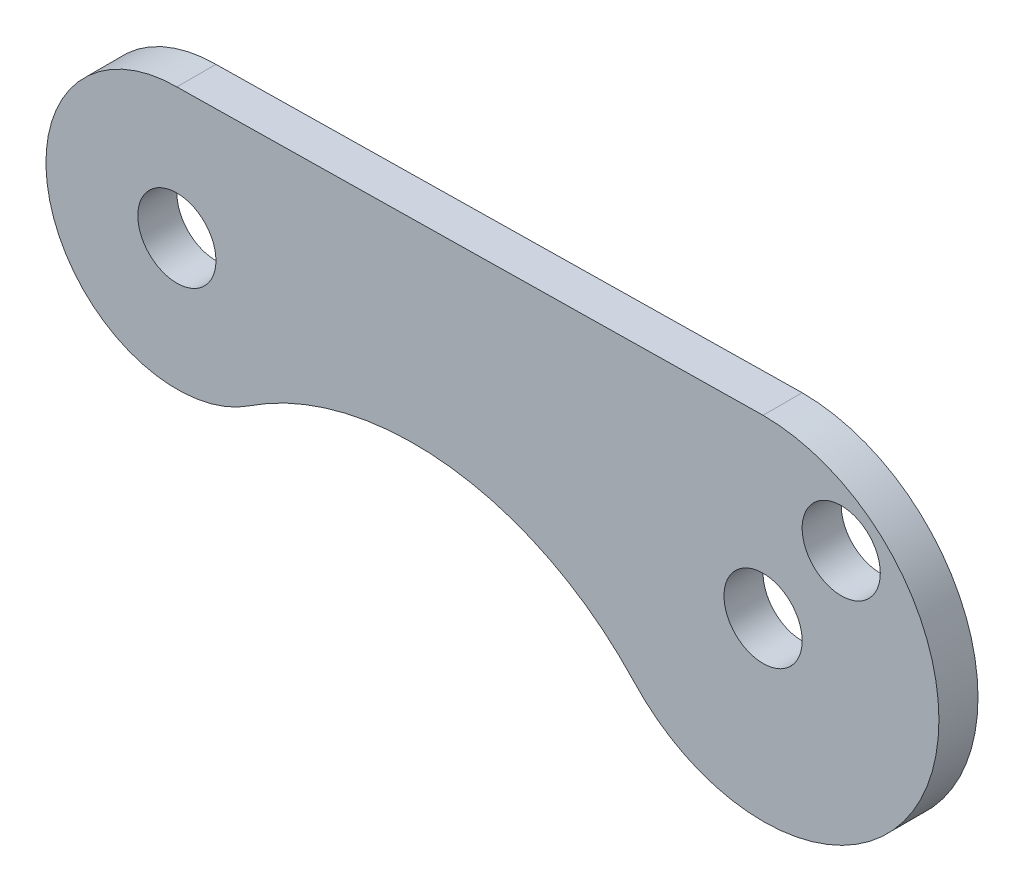
ISO-10303-21;
HEADER;
FILE_DESCRIPTION(('STEP AP214'),'2;1');
FILE_NAME('part.step','',(''),(''),'','','');
FILE_SCHEMA(('AUTOMOTIVE_DESIGN { 1 0 10303 214 1 1 1 1 }'));
ENDSEC;
DATA;
#1=APPLICATION_CONTEXT('core data for automotive mechanical design processes');
#2=APPLICATION_PROTOCOL_DEFINITION('international standard','automotive_design',2000,#1);
#3=PRODUCT_CONTEXT('',#1,'mechanical');
#4=PRODUCT('Part','Part','',(#3));
#5=PRODUCT_RELATED_PRODUCT_CATEGORY('part','',(#4));
#6=PRODUCT_DEFINITION_FORMATION('','',#4);
#7=PRODUCT_DEFINITION_CONTEXT('part definition',#1,'design');
#8=PRODUCT_DEFINITION('design','',#6,#7);
#9=PRODUCT_DEFINITION_SHAPE('','',#8);
#10=(LENGTH_UNIT() NAMED_UNIT(*) SI_UNIT(.MILLI.,.METRE.));
#11=(NAMED_UNIT(*) PLANE_ANGLE_UNIT() SI_UNIT($,.RADIAN.));
#12=(NAMED_UNIT(*) SI_UNIT($,.STERADIAN.) SOLID_ANGLE_UNIT());
#13=UNCERTAINTY_MEASURE_WITH_UNIT(LENGTH_MEASURE(1.E-05),#10,'distance_accuracy_value','');
#14=(GEOMETRIC_REPRESENTATION_CONTEXT(3) GLOBAL_UNCERTAINTY_ASSIGNED_CONTEXT((#13)) GLOBAL_UNIT_ASSIGNED_CONTEXT((#10,
#11,#12)) REPRESENTATION_CONTEXT('',''));
#15=CARTESIAN_POINT('',(0.,0.,0.));
#16=DIRECTION('',(0.,0.,1.));
#17=DIRECTION('',(1.,0.,0.));
#18=AXIS2_PLACEMENT_3D('',#15,#16,#17);
#19=CARTESIAN_POINT('',(-18.8712732785137,-16.2120855661541,2.));
#20=DIRECTION('',(0.,0.,-1.));
#21=DIRECTION('',(-1.,0.,0.));
#22=AXIS2_PLACEMENT_3D('',#19,#20,#21);
#23=CYLINDRICAL_SURFACE('',#22,15.3);
#24=CARTESIAN_POINT('',(-18.8712732785137,-16.2120855661541,0.));
#25=DIRECTION('',(0.,0.,1.));
#26=DIRECTION('',(1.,0.,0.));
#27=AXIS2_PLACEMENT_3D('',#24,#25,#26);
#28=CIRCLE('',#27,15.3);
#29=CARTESIAN_POINT('',(-7.63202362524581,-5.83088779173919,0.));
#30=VERTEX_POINT('',#29);
#31=CARTESIAN_POINT('',(-27.3206475251314,-3.45677001378166,0.));
#32=VERTEX_POINT('',#31);
#33=EDGE_CURVE('E108',#30,#32,#28,.T.);
#34=ORIENTED_EDGE('',*,*,#33,.F.);
#35=DIRECTION('',(0.,0.,-1.));
#36=VECTOR('',#35,1.);
#37=CARTESIAN_POINT('',(-7.63202362524581,-5.83088779173919,2.));
#38=LINE('',#37,#36);
#39=CARTESIAN_POINT('',(-7.63202362524581,-5.83088779173919,2.));
#40=VERTEX_POINT('',#39);
#41=EDGE_CURVE('E11',#40,#30,#38,.T.);
#42=ORIENTED_EDGE('',*,*,#41,.F.);
#43=CARTESIAN_POINT('',(-18.8712732785137,-16.2120855661541,2.));
#44=DIRECTION('',(0.,0.,1.));
#45=DIRECTION('',(1.,0.,0.));
#46=AXIS2_PLACEMENT_3D('',#43,#44,#45);
#47=CIRCLE('',#46,15.3);
#48=CARTESIAN_POINT('',(-27.3206475251314,-3.45677001378166,2.));
#49=VERTEX_POINT('',#48);
#50=EDGE_CURVE('E84',#40,#49,#47,.T.);
#51=ORIENTED_EDGE('',*,*,#50,.T.);
#52=DIRECTION('',(0.,0.,-1.));
#53=VECTOR('',#52,1.);
#54=CARTESIAN_POINT('',(-27.3206475251314,-3.45677001378166,2.));
#55=LINE('',#54,#53);
#56=EDGE_CURVE('E74',#49,#32,#55,.T.);
#57=ORIENTED_EDGE('',*,*,#56,.T.);
#58=EDGE_LOOP('',(#34,#42,#51,#57));
#59=FACE_BOUND('',#58,.T.);
#60=ADVANCED_FACE('F35',(#59),#23,.F.);
#61=CARTESIAN_POINT('',(-1.02070029979408,0.275699134387217,2.));
#62=DIRECTION('',(0.,0.,-1.));
#63=DIRECTION('',(-1.,0.,0.));
#64=AXIS2_PLACEMENT_3D('',#61,#62,#63);
#65=CYLINDRICAL_SURFACE('',#64,9.);
#66=CARTESIAN_POINT('',(-1.02070029979408,0.275699134387217,0.));
#67=DIRECTION('',(0.,0.,1.));
#68=DIRECTION('',(1.,0.,0.));
#69=AXIS2_PLACEMENT_3D('',#66,#67,#68);
#70=CIRCLE('',#69,9.);
#71=CARTESIAN_POINT('',(-1.02070029979408,9.27569913438722,0.));
#72=VERTEX_POINT('',#71);
#73=EDGE_CURVE('E90',#30,#72,#70,.T.);
#74=ORIENTED_EDGE('',*,*,#73,.T.);
#75=DIRECTION('',(0.,0.,-1.));
#76=VECTOR('',#75,1.);
#77=CARTESIAN_POINT('',(-1.02070029979408,9.27569913438722,2.));
#78=LINE('',#77,#76);
#79=CARTESIAN_POINT('',(-1.02070029979408,9.27569913438722,2.));
#80=VERTEX_POINT('',#79);
#81=EDGE_CURVE('E44',#80,#72,#78,.T.);
#82=ORIENTED_EDGE('',*,*,#81,.F.);
#83=CARTESIAN_POINT('',(-1.02070029979408,0.275699134387217,2.));
#84=DIRECTION('',(0.,0.,1.));
#85=DIRECTION('',(1.,0.,0.));
#86=AXIS2_PLACEMENT_3D('',#83,#84,#85);
#87=CIRCLE('',#86,9.);
#88=EDGE_CURVE('E79',#40,#80,#87,.T.);
#89=ORIENTED_EDGE('',*,*,#88,.F.);
#90=ORIENTED_EDGE('',*,*,#41,.T.);
#91=EDGE_LOOP('',(#74,#82,#89,#90));
#92=FACE_BOUND('',#91,.T.);
#93=ADVANCED_FACE('F88',(#92),#65,.T.);
#94=CARTESIAN_POINT('',(-0.138344303920579,9.28884059427345,2.));
#95=DIRECTION('',(-0.0148919514058761,0.999889108743227,0.));
#96=DIRECTION('',(-0.999889108743227,-0.0148919514058761,0.));
#97=AXIS2_PLACEMENT_3D('',#94,#95,#96);
#98=PLANE('',#97);
#99=DIRECTION('',(0.999889108743227,0.0148919514058761,0.));
#100=VECTOR('',#99,1.);
#101=CARTESIAN_POINT('',(-0.138344303920579,9.28884059427345,0.));
#102=LINE('',#101,#100);
#103=CARTESIAN_POINT('',(-31.0207002997941,8.82889104510038,0.));
#104=VERTEX_POINT('',#103);
#105=EDGE_CURVE('E112',#104,#72,#102,.T.);
#106=ORIENTED_EDGE('',*,*,#105,.F.);
#107=DIRECTION('',(0.,0.,-1.));
#108=VECTOR('',#107,1.);
#109=CARTESIAN_POINT('',(-31.0207002997941,8.82889104510038,2.));
#110=LINE('',#109,#108);
#111=CARTESIAN_POINT('',(-31.0207002997941,8.82889104510038,2.));
#112=VERTEX_POINT('',#111);
#113=EDGE_CURVE('E67',#112,#104,#110,.T.);
#114=ORIENTED_EDGE('',*,*,#113,.F.);
#115=DIRECTION('',(0.999889108743227,0.0148919514058761,0.));
#116=VECTOR('',#115,1.);
#117=CARTESIAN_POINT('',(-0.138344303920579,9.28884059427345,2.));
#118=LINE('',#117,#116);
#119=EDGE_CURVE('E83',#112,#80,#118,.T.);
#120=ORIENTED_EDGE('',*,*,#119,.T.);
#121=ORIENTED_EDGE('',*,*,#81,.T.);
#122=EDGE_LOOP('',(#106,#114,#120,#121));
#123=FACE_BOUND('',#122,.T.);
#124=ADVANCED_FACE('F94',(#123),#98,.T.);
#125=CARTESIAN_POINT('',(-31.0207002997941,2.12889104510037,2.));
#126=DIRECTION('',(0.,0.,-1.));
#127=DIRECTION('',(-1.,0.,0.));
#128=AXIS2_PLACEMENT_3D('',#125,#126,#127);
#129=CYLINDRICAL_SURFACE('',#128,2.);
#130=CARTESIAN_POINT('',(-31.0207002997941,2.12889104510037,2.));
#131=DIRECTION('',(0.,0.,1.));
#132=DIRECTION('',(1.,0.,0.));
#133=AXIS2_PLACEMENT_3D('',#130,#131,#132);
#134=CIRCLE('',#133,2.);
#135=CARTESIAN_POINT('',(-29.0207002997941,2.12889104510037,2.));
#136=VERTEX_POINT('',#135);
#137=EDGE_CURVE('E124',#136,#136,#134,.T.);
#138=ORIENTED_EDGE('',*,*,#137,.T.);
#139=EDGE_LOOP('',(#138));
#140=FACE_BOUND('',#139,.T.);
#141=CARTESIAN_POINT('',(-31.0207002997941,2.12889104510037,0.));
#142=DIRECTION('',(0.,0.,1.));
#143=DIRECTION('',(1.,0.,0.));
#144=AXIS2_PLACEMENT_3D('',#141,#142,#143);
#145=CIRCLE('',#144,2.);
#146=CARTESIAN_POINT('',(-29.0207002997941,2.12889104510037,0.));
#147=VERTEX_POINT('',#146);
#148=EDGE_CURVE('E105',#147,#147,#145,.T.);
#149=ORIENTED_EDGE('',*,*,#148,.F.);
#150=EDGE_LOOP('',(#149));
#151=FACE_BOUND('',#150,.T.);
#152=ADVANCED_FACE('F136',(#140,#151),#129,.F.);
#153=CARTESIAN_POINT('',(-1.02070029979408,0.275699134387217,2.));
#154=DIRECTION('',(0.,0.,-1.));
#155=DIRECTION('',(-1.,0.,0.));
#156=AXIS2_PLACEMENT_3D('',#153,#154,#155);
#157=CYLINDRICAL_SURFACE('',#156,2.);
#158=CARTESIAN_POINT('',(-1.02070029979408,0.275699134387217,2.));
#159=DIRECTION('',(0.,0.,1.));
#160=DIRECTION('',(1.,0.,0.));
#161=AXIS2_PLACEMENT_3D('',#158,#159,#160);
#162=CIRCLE('',#161,2.);
#163=CARTESIAN_POINT('',(0.979299700205919,0.275699134387217,2.));
#164=VERTEX_POINT('',#163);
#165=EDGE_CURVE('E119',#164,#164,#162,.T.);
#166=ORIENTED_EDGE('',*,*,#165,.T.);
#167=EDGE_LOOP('',(#166));
#168=FACE_BOUND('',#167,.T.);
#169=CARTESIAN_POINT('',(-1.02070029979408,0.275699134387217,0.));
#170=DIRECTION('',(0.,0.,1.));
#171=DIRECTION('',(1.,0.,0.));
#172=AXIS2_PLACEMENT_3D('',#169,#170,#171);
#173=CIRCLE('',#172,2.);
#174=CARTESIAN_POINT('',(0.979299700205919,0.275699134387217,0.));
#175=VERTEX_POINT('',#174);
#176=EDGE_CURVE('E102',#175,#175,#173,.T.);
#177=ORIENTED_EDGE('',*,*,#176,.F.);
#178=EDGE_LOOP('',(#177));
#179=FACE_BOUND('',#178,.T.);
#180=ADVANCED_FACE('F138',(#168,#179),#157,.F.);
#181=CARTESIAN_POINT('',(2.97929970020592,5.27569913438722,2.));
#182=DIRECTION('',(0.,0.,-1.));
#183=DIRECTION('',(-1.,0.,0.));
#184=AXIS2_PLACEMENT_3D('',#181,#182,#183);
#185=CYLINDRICAL_SURFACE('',#184,2.);
#186=CARTESIAN_POINT('',(2.97929970020592,5.27569913438722,2.));
#187=DIRECTION('',(0.,0.,1.));
#188=DIRECTION('',(1.,0.,0.));
#189=AXIS2_PLACEMENT_3D('',#186,#187,#188);
#190=CIRCLE('',#189,2.);
#191=CARTESIAN_POINT('',(4.97929970020592,5.27569913438722,2.));
#192=VERTEX_POINT('',#191);
#193=EDGE_CURVE('E116',#192,#192,#190,.T.);
#194=ORIENTED_EDGE('',*,*,#193,.T.);
#195=EDGE_LOOP('',(#194));
#196=FACE_BOUND('',#195,.T.);
#197=CARTESIAN_POINT('',(2.97929970020592,5.27569913438722,0.));
#198=DIRECTION('',(0.,0.,1.));
#199=DIRECTION('',(1.,0.,0.));
#200=AXIS2_PLACEMENT_3D('',#197,#198,#199);
#201=CIRCLE('',#200,2.);
#202=CARTESIAN_POINT('',(4.97929970020592,5.27569913438722,0.));
#203=VERTEX_POINT('',#202);
#204=EDGE_CURVE('E99',#203,#203,#201,.T.);
#205=ORIENTED_EDGE('',*,*,#204,.F.);
#206=EDGE_LOOP('',(#205));
#207=FACE_BOUND('',#206,.T.);
#208=ADVANCED_FACE('F37',(#196,#207),#185,.F.);
#209=CARTESIAN_POINT('',(-31.0207002997941,2.12889104510037,2.));
#210=DIRECTION('',(0.,0.,-1.));
#211=DIRECTION('',(-1.,0.,0.));
#212=AXIS2_PLACEMENT_3D('',#209,#210,#211);
#213=CYLINDRICAL_SURFACE('',#212,6.7);
#214=CARTESIAN_POINT('',(-31.0207002997941,2.12889104510037,0.));
#215=DIRECTION('',(0.,0.,1.));
#216=DIRECTION('',(1.,0.,0.));
#217=AXIS2_PLACEMENT_3D('',#214,#215,#216);
#218=CIRCLE('',#217,6.7);
#219=EDGE_CURVE('E114',#104,#32,#218,.T.);
#220=ORIENTED_EDGE('',*,*,#219,.T.);
#221=ORIENTED_EDGE('',*,*,#56,.F.);
#222=CARTESIAN_POINT('',(-31.0207002997941,2.12889104510037,2.));
#223=DIRECTION('',(0.,0.,1.));
#224=DIRECTION('',(1.,0.,0.));
#225=AXIS2_PLACEMENT_3D('',#222,#223,#224);
#226=CIRCLE('',#225,6.7);
#227=EDGE_CURVE('E52',#112,#49,#226,.T.);
#228=ORIENTED_EDGE('',*,*,#227,.F.);
#229=ORIENTED_EDGE('',*,*,#113,.T.);
#230=EDGE_LOOP('',(#220,#221,#228,#229));
#231=FACE_BOUND('',#230,.T.);
#232=ADVANCED_FACE('F145',(#231),#213,.T.);
#233=CARTESIAN_POINT('',(0.,0.,2.));
#234=DIRECTION('',(0.,0.,1.));
#235=DIRECTION('',(1.,0.,0.));
#236=AXIS2_PLACEMENT_3D('',#233,#234,#235);
#237=PLANE('',#236);
#238=ORIENTED_EDGE('',*,*,#193,.F.);
#239=EDGE_LOOP('',(#238));
#240=FACE_BOUND('',#239,.T.);
#241=ORIENTED_EDGE('',*,*,#165,.F.);
#242=EDGE_LOOP('',(#241));
#243=FACE_BOUND('',#242,.T.);
#244=ORIENTED_EDGE('',*,*,#137,.F.);
#245=EDGE_LOOP('',(#244));
#246=FACE_BOUND('',#245,.T.);
#247=ORIENTED_EDGE('',*,*,#50,.F.);
#248=ORIENTED_EDGE('',*,*,#88,.T.);
#249=ORIENTED_EDGE('',*,*,#119,.F.);
#250=ORIENTED_EDGE('',*,*,#227,.T.);
#251=EDGE_LOOP('',(#247,#248,#249,#250));
#252=FACE_BOUND('',#251,.T.);
#253=ADVANCED_FACE('F81',(#240,#243,#246,#252),#237,.T.);
#254=CARTESIAN_POINT('',(0.,0.,0.));
#255=DIRECTION('',(0.,0.,1.));
#256=DIRECTION('',(1.,0.,0.));
#257=AXIS2_PLACEMENT_3D('',#254,#255,#256);
#258=PLANE('',#257);
#259=ORIENTED_EDGE('',*,*,#204,.T.);
#260=EDGE_LOOP('',(#259));
#261=FACE_BOUND('',#260,.T.);
#262=ORIENTED_EDGE('',*,*,#176,.T.);
#263=EDGE_LOOP('',(#262));
#264=FACE_BOUND('',#263,.T.);
#265=ORIENTED_EDGE('',*,*,#148,.T.);
#266=EDGE_LOOP('',(#265));
#267=FACE_BOUND('',#266,.T.);
#268=ORIENTED_EDGE('',*,*,#33,.T.);
#269=ORIENTED_EDGE('',*,*,#219,.F.);
#270=ORIENTED_EDGE('',*,*,#105,.T.);
#271=ORIENTED_EDGE('',*,*,#73,.F.);
#272=EDGE_LOOP('',(#268,#269,#270,#271));
#273=FACE_BOUND('',#272,.T.);
#274=ADVANCED_FACE('F150',(#261,#264,#267,#273),#258,.F.);
#275=CLOSED_SHELL('',(#60,#93,#124,#152,#180,#208,#232,#253,#274));
#276=MANIFOLD_SOLID_BREP('B2',#275);
#277=ADVANCED_BREP_SHAPE_REPRESENTATION('',(#18,#276),#14);
#278=SHAPE_DEFINITION_REPRESENTATION(#9,#277);
ENDSEC;
END-ISO-10303-21;
